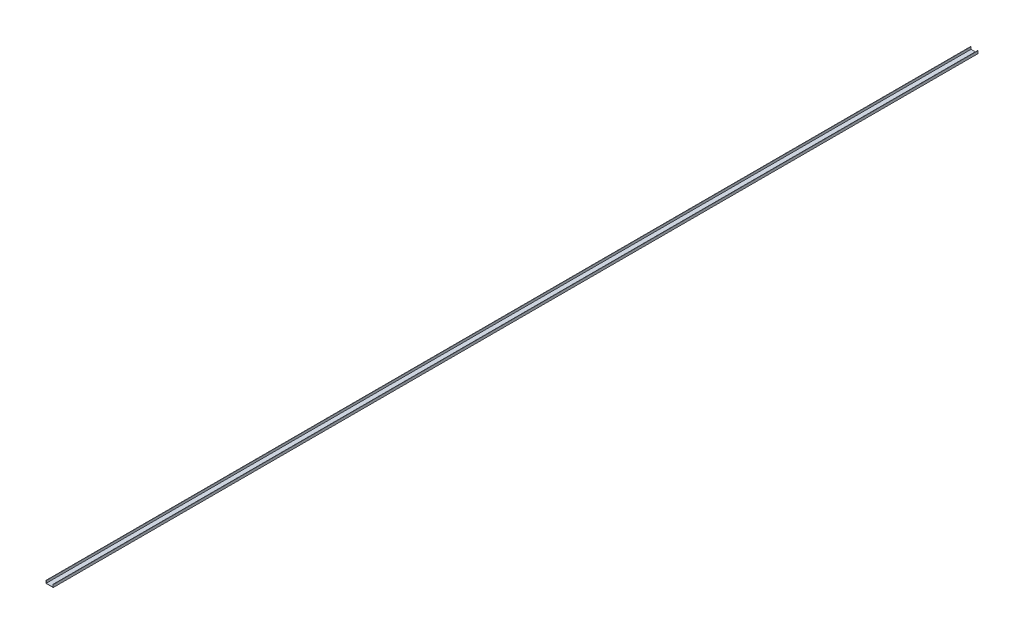
ISO-10303-21;
HEADER;
FILE_DESCRIPTION(('STEP AP214'),'2;1');
FILE_NAME('part.step','',(''),(''),'','','');
FILE_SCHEMA(('AUTOMOTIVE_DESIGN { 1 0 10303 214 1 1 1 1 }'));
ENDSEC;
DATA;
#1=APPLICATION_CONTEXT('core data for automotive mechanical design processes');
#2=APPLICATION_PROTOCOL_DEFINITION('international standard','automotive_design',2000,#1);
#3=PRODUCT_CONTEXT('',#1,'mechanical');
#4=PRODUCT('Part','Part','',(#3));
#5=PRODUCT_RELATED_PRODUCT_CATEGORY('part','',(#4));
#6=PRODUCT_DEFINITION_FORMATION('','',#4);
#7=PRODUCT_DEFINITION_CONTEXT('part definition',#1,'design');
#8=PRODUCT_DEFINITION('design','',#6,#7);
#9=PRODUCT_DEFINITION_SHAPE('','',#8);
#10=(LENGTH_UNIT() NAMED_UNIT(*) SI_UNIT(.MILLI.,.METRE.));
#11=(NAMED_UNIT(*) PLANE_ANGLE_UNIT() SI_UNIT($,.RADIAN.));
#12=(NAMED_UNIT(*) SI_UNIT($,.STERADIAN.) SOLID_ANGLE_UNIT());
#13=UNCERTAINTY_MEASURE_WITH_UNIT(LENGTH_MEASURE(1.E-05),#10,'distance_accuracy_value','');
#14=(GEOMETRIC_REPRESENTATION_CONTEXT(3) GLOBAL_UNCERTAINTY_ASSIGNED_CONTEXT((#13)) GLOBAL_UNIT_ASSIGNED_CONTEXT((#10,
#11,#12)) REPRESENTATION_CONTEXT('',''));
#15=CARTESIAN_POINT('',(0.,0.,0.));
#16=DIRECTION('',(0.,0.,1.));
#17=DIRECTION('',(1.,0.,0.));
#18=AXIS2_PLACEMENT_3D('',#15,#16,#17);
#19=CARTESIAN_POINT('',(0.999999999999999,10.,3460.));
#20=DIRECTION('',(0.,-1.,0.));
#21=DIRECTION('',(0.,0.,-1.));
#22=AXIS2_PLACEMENT_3D('',#19,#20,#21);
#23=PLANE('',#22);
#24=DIRECTION('',(-1.,0.,0.));
#25=VECTOR('',#24,1.);
#26=CARTESIAN_POINT('',(0.999999999999999,10.,0.));
#27=LINE('',#26,#25);
#28=CARTESIAN_POINT('',(0.999999999999999,10.,0.));
#29=VERTEX_POINT('',#28);
#30=CARTESIAN_POINT('',(0.,10.,0.));
#31=VERTEX_POINT('',#30);
#32=EDGE_CURVE('E133',#29,#31,#27,.T.);
#33=ORIENTED_EDGE('',*,*,#32,.T.);
#34=DIRECTION('',(0.,0.,-1.));
#35=VECTOR('',#34,1.);
#36=CARTESIAN_POINT('',(0.,10.,3460.));
#37=LINE('',#36,#35);
#38=CARTESIAN_POINT('',(0.,10.,3460.));
#39=VERTEX_POINT('',#38);
#40=EDGE_CURVE('E11',#39,#31,#37,.T.);
#41=ORIENTED_EDGE('',*,*,#40,.F.);
#42=DIRECTION('',(-1.,0.,0.));
#43=VECTOR('',#42,1.);
#44=CARTESIAN_POINT('',(0.999999999999999,10.,3460.));
#45=LINE('',#44,#43);
#46=CARTESIAN_POINT('',(0.999999999999999,10.,3460.));
#47=VERTEX_POINT('',#46);
#48=EDGE_CURVE('E147',#47,#39,#45,.T.);
#49=ORIENTED_EDGE('',*,*,#48,.F.);
#50=DIRECTION('',(0.,0.,-1.));
#51=VECTOR('',#50,1.);
#52=CARTESIAN_POINT('',(0.999999999999999,10.,3460.));
#53=LINE('',#52,#51);
#54=EDGE_CURVE('E129',#47,#29,#53,.T.);
#55=ORIENTED_EDGE('',*,*,#54,.T.);
#56=EDGE_LOOP('',(#33,#41,#49,#55));
#57=FACE_BOUND('',#56,.T.);
#58=ADVANCED_FACE('F37',(#57),#23,.F.);
#59=CARTESIAN_POINT('',(0.,10.,3460.));
#60=DIRECTION('',(1.,0.,0.));
#61=DIRECTION('',(0.,1.,0.));
#62=AXIS2_PLACEMENT_3D('',#59,#60,#61);
#63=PLANE('',#62);
#64=DIRECTION('',(0.,-1.,0.));
#65=VECTOR('',#64,1.);
#66=CARTESIAN_POINT('',(0.,10.,0.));
#67=LINE('',#66,#65);
#68=CARTESIAN_POINT('',(0.,0.,0.));
#69=VERTEX_POINT('',#68);
#70=EDGE_CURVE('E136',#31,#69,#67,.T.);
#71=ORIENTED_EDGE('',*,*,#70,.T.);
#72=DIRECTION('',(0.,0.,-1.));
#73=VECTOR('',#72,1.);
#74=CARTESIAN_POINT('',(0.,0.,3460.));
#75=LINE('',#74,#73);
#76=CARTESIAN_POINT('',(0.,0.,3460.));
#77=VERTEX_POINT('',#76);
#78=EDGE_CURVE('E45',#77,#69,#75,.T.);
#79=ORIENTED_EDGE('',*,*,#78,.F.);
#80=DIRECTION('',(0.,-1.,0.));
#81=VECTOR('',#80,1.);
#82=CARTESIAN_POINT('',(0.,10.,3460.));
#83=LINE('',#82,#81);
#84=EDGE_CURVE('E96',#39,#77,#83,.T.);
#85=ORIENTED_EDGE('',*,*,#84,.F.);
#86=ORIENTED_EDGE('',*,*,#40,.T.);
#87=EDGE_LOOP('',(#71,#79,#85,#86));
#88=FACE_BOUND('',#87,.T.);
#89=ADVANCED_FACE('F182',(#88),#63,.F.);
#90=CARTESIAN_POINT('',(0.,0.,3460.));
#91=DIRECTION('',(0.,1.,0.));
#92=DIRECTION('',(0.,0.,1.));
#93=AXIS2_PLACEMENT_3D('',#90,#91,#92);
#94=PLANE('',#93);
#95=DIRECTION('',(1.,0.,0.));
#96=VECTOR('',#95,1.);
#97=CARTESIAN_POINT('',(0.,0.,0.));
#98=LINE('',#97,#96);
#99=CARTESIAN_POINT('',(27.,0.,0.));
#100=VERTEX_POINT('',#99);
#101=EDGE_CURVE('E138',#69,#100,#98,.T.);
#102=ORIENTED_EDGE('',*,*,#101,.T.);
#103=DIRECTION('',(0.,0.,-1.));
#104=VECTOR('',#103,1.);
#105=CARTESIAN_POINT('',(27.,0.,3460.));
#106=LINE('',#105,#104);
#107=CARTESIAN_POINT('',(27.,0.,3460.));
#108=VERTEX_POINT('',#107);
#109=EDGE_CURVE('E154',#108,#100,#106,.T.);
#110=ORIENTED_EDGE('',*,*,#109,.F.);
#111=DIRECTION('',(1.,0.,0.));
#112=VECTOR('',#111,1.);
#113=CARTESIAN_POINT('',(0.,0.,3460.));
#114=LINE('',#113,#112);
#115=EDGE_CURVE('E162',#77,#108,#114,.T.);
#116=ORIENTED_EDGE('',*,*,#115,.F.);
#117=ORIENTED_EDGE('',*,*,#78,.T.);
#118=EDGE_LOOP('',(#102,#110,#116,#117));
#119=FACE_BOUND('',#118,.T.);
#120=ADVANCED_FACE('F160',(#119),#94,.F.);
#121=CARTESIAN_POINT('',(27.,0.,3460.));
#122=DIRECTION('',(-1.,0.,0.));
#123=DIRECTION('',(0.,0.,1.));
#124=AXIS2_PLACEMENT_3D('',#121,#122,#123);
#125=PLANE('',#124);
#126=DIRECTION('',(0.,1.,0.));
#127=VECTOR('',#126,1.);
#128=CARTESIAN_POINT('',(27.,0.,0.));
#129=LINE('',#128,#127);
#130=CARTESIAN_POINT('',(27.,10.,0.));
#131=VERTEX_POINT('',#130);
#132=EDGE_CURVE('E140',#100,#131,#129,.T.);
#133=ORIENTED_EDGE('',*,*,#132,.T.);
#134=DIRECTION('',(0.,0.,-1.));
#135=VECTOR('',#134,1.);
#136=CARTESIAN_POINT('',(27.,10.,3460.));
#137=LINE('',#136,#135);
#138=CARTESIAN_POINT('',(27.,10.,3460.));
#139=VERTEX_POINT('',#138);
#140=EDGE_CURVE('E151',#139,#131,#137,.T.);
#141=ORIENTED_EDGE('',*,*,#140,.F.);
#142=DIRECTION('',(0.,1.,0.));
#143=VECTOR('',#142,1.);
#144=CARTESIAN_POINT('',(27.,0.,3460.));
#145=LINE('',#144,#143);
#146=EDGE_CURVE('E174',#108,#139,#145,.T.);
#147=ORIENTED_EDGE('',*,*,#146,.F.);
#148=ORIENTED_EDGE('',*,*,#109,.T.);
#149=EDGE_LOOP('',(#133,#141,#147,#148));
#150=FACE_BOUND('',#149,.T.);
#151=ADVANCED_FACE('F170',(#150),#125,.F.);
#152=CARTESIAN_POINT('',(27.,10.,3460.));
#153=DIRECTION('',(0.,-1.,0.));
#154=DIRECTION('',(1.,0.,0.));
#155=AXIS2_PLACEMENT_3D('',#152,#153,#154);
#156=PLANE('',#155);
#157=DIRECTION('',(-1.,0.,0.));
#158=VECTOR('',#157,1.);
#159=CARTESIAN_POINT('',(27.,10.,0.));
#160=LINE('',#159,#158);
#161=CARTESIAN_POINT('',(26.,10.,0.));
#162=VERTEX_POINT('',#161);
#163=EDGE_CURVE('E142',#131,#162,#160,.T.);
#164=ORIENTED_EDGE('',*,*,#163,.T.);
#165=DIRECTION('',(0.,0.,-1.));
#166=VECTOR('',#165,1.);
#167=CARTESIAN_POINT('',(26.,10.,3460.));
#168=LINE('',#167,#166);
#169=CARTESIAN_POINT('',(26.,10.,3460.));
#170=VERTEX_POINT('',#169);
#171=EDGE_CURVE('E124',#170,#162,#168,.T.);
#172=ORIENTED_EDGE('',*,*,#171,.F.);
#173=DIRECTION('',(-1.,0.,0.));
#174=VECTOR('',#173,1.);
#175=CARTESIAN_POINT('',(27.,10.,3460.));
#176=LINE('',#175,#174);
#177=EDGE_CURVE('E115',#139,#170,#176,.T.);
#178=ORIENTED_EDGE('',*,*,#177,.F.);
#179=ORIENTED_EDGE('',*,*,#140,.T.);
#180=EDGE_LOOP('',(#164,#172,#178,#179));
#181=FACE_BOUND('',#180,.T.);
#182=ADVANCED_FACE('F173',(#181),#156,.F.);
#183=CARTESIAN_POINT('',(26.,10.,3460.));
#184=DIRECTION('',(1.,0.,0.));
#185=DIRECTION('',(0.,0.,-1.));
#186=AXIS2_PLACEMENT_3D('',#183,#184,#185);
#187=PLANE('',#186);
#188=DIRECTION('',(0.,-1.,0.));
#189=VECTOR('',#188,1.);
#190=CARTESIAN_POINT('',(26.,10.,0.));
#191=LINE('',#190,#189);
#192=CARTESIAN_POINT('',(26.,1.,0.));
#193=VERTEX_POINT('',#192);
#194=EDGE_CURVE('E123',#162,#193,#191,.T.);
#195=ORIENTED_EDGE('',*,*,#194,.T.);
#196=DIRECTION('',(0.,0.,-1.));
#197=VECTOR('',#196,1.);
#198=CARTESIAN_POINT('',(26.,1.,3460.));
#199=LINE('',#198,#197);
#200=CARTESIAN_POINT('',(26.,1.,3460.));
#201=VERTEX_POINT('',#200);
#202=EDGE_CURVE('E120',#201,#193,#199,.T.);
#203=ORIENTED_EDGE('',*,*,#202,.F.);
#204=DIRECTION('',(0.,-1.,0.));
#205=VECTOR('',#204,1.);
#206=CARTESIAN_POINT('',(26.,10.,3460.));
#207=LINE('',#206,#205);
#208=EDGE_CURVE('E109',#170,#201,#207,.T.);
#209=ORIENTED_EDGE('',*,*,#208,.F.);
#210=ORIENTED_EDGE('',*,*,#171,.T.);
#211=EDGE_LOOP('',(#195,#203,#209,#210));
#212=FACE_BOUND('',#211,.T.);
#213=ADVANCED_FACE('F121',(#212),#187,.F.);
#214=CARTESIAN_POINT('',(26.,1.,3460.));
#215=DIRECTION('',(0.,-1.,0.));
#216=DIRECTION('',(1.,0.,0.));
#217=AXIS2_PLACEMENT_3D('',#214,#215,#216);
#218=PLANE('',#217);
#219=DIRECTION('',(-1.,0.,0.));
#220=VECTOR('',#219,1.);
#221=CARTESIAN_POINT('',(26.,1.,0.));
#222=LINE('',#221,#220);
#223=CARTESIAN_POINT('',(1.,0.999999999999998,0.));
#224=VERTEX_POINT('',#223);
#225=EDGE_CURVE('E82',#193,#224,#222,.T.);
#226=ORIENTED_EDGE('',*,*,#225,.T.);
#227=DIRECTION('',(0.,0.,-1.));
#228=VECTOR('',#227,1.);
#229=CARTESIAN_POINT('',(1.,0.999999999999998,3460.));
#230=LINE('',#229,#228);
#231=CARTESIAN_POINT('',(1.,0.999999999999998,3460.));
#232=VERTEX_POINT('',#231);
#233=EDGE_CURVE('E125',#232,#224,#230,.T.);
#234=ORIENTED_EDGE('',*,*,#233,.F.);
#235=DIRECTION('',(-1.,0.,0.));
#236=VECTOR('',#235,1.);
#237=CARTESIAN_POINT('',(26.,1.,3460.));
#238=LINE('',#237,#236);
#239=EDGE_CURVE('E113',#201,#232,#238,.T.);
#240=ORIENTED_EDGE('',*,*,#239,.F.);
#241=ORIENTED_EDGE('',*,*,#202,.T.);
#242=EDGE_LOOP('',(#226,#234,#240,#241));
#243=FACE_BOUND('',#242,.T.);
#244=ADVANCED_FACE('F127',(#243),#218,.F.);
#245=CARTESIAN_POINT('',(1.,0.999999999999998,3460.));
#246=DIRECTION('',(-1.,0.,0.));
#247=DIRECTION('',(0.,-1.,0.));
#248=AXIS2_PLACEMENT_3D('',#245,#246,#247);
#249=PLANE('',#248);
#250=DIRECTION('',(0.,1.,0.));
#251=VECTOR('',#250,1.);
#252=CARTESIAN_POINT('',(1.,0.999999999999998,0.));
#253=LINE('',#252,#251);
#254=EDGE_CURVE('E88',#224,#29,#253,.T.);
#255=ORIENTED_EDGE('',*,*,#254,.T.);
#256=ORIENTED_EDGE('',*,*,#54,.F.);
#257=DIRECTION('',(0.,1.,0.));
#258=VECTOR('',#257,1.);
#259=CARTESIAN_POINT('',(1.,0.999999999999998,3460.));
#260=LINE('',#259,#258);
#261=EDGE_CURVE('E53',#232,#47,#260,.T.);
#262=ORIENTED_EDGE('',*,*,#261,.F.);
#263=ORIENTED_EDGE('',*,*,#233,.T.);
#264=EDGE_LOOP('',(#255,#256,#262,#263));
#265=FACE_BOUND('',#264,.T.);
#266=ADVANCED_FACE('F198',(#265),#249,.F.);
#267=CARTESIAN_POINT('',(0.,0.,3460.));
#268=DIRECTION('',(0.,0.,1.));
#269=DIRECTION('',(1.,0.,0.));
#270=AXIS2_PLACEMENT_3D('',#267,#268,#269);
#271=PLANE('',#270);
#272=ORIENTED_EDGE('',*,*,#48,.T.);
#273=ORIENTED_EDGE('',*,*,#84,.T.);
#274=ORIENTED_EDGE('',*,*,#115,.T.);
#275=ORIENTED_EDGE('',*,*,#146,.T.);
#276=ORIENTED_EDGE('',*,*,#177,.T.);
#277=ORIENTED_EDGE('',*,*,#208,.T.);
#278=ORIENTED_EDGE('',*,*,#239,.T.);
#279=ORIENTED_EDGE('',*,*,#261,.T.);
#280=EDGE_LOOP('',(#272,#273,#274,#275,#276,#277,#278,#279));
#281=FACE_BOUND('',#280,.T.);
#282=ADVANCED_FACE('F111',(#281),#271,.T.);
#283=CARTESIAN_POINT('',(0.,0.,0.));
#284=DIRECTION('',(0.,0.,1.));
#285=DIRECTION('',(1.,0.,0.));
#286=AXIS2_PLACEMENT_3D('',#283,#284,#285);
#287=PLANE('',#286);
#288=ORIENTED_EDGE('',*,*,#32,.F.);
#289=ORIENTED_EDGE('',*,*,#254,.F.);
#290=ORIENTED_EDGE('',*,*,#225,.F.);
#291=ORIENTED_EDGE('',*,*,#194,.F.);
#292=ORIENTED_EDGE('',*,*,#163,.F.);
#293=ORIENTED_EDGE('',*,*,#132,.F.);
#294=ORIENTED_EDGE('',*,*,#101,.F.);
#295=ORIENTED_EDGE('',*,*,#70,.F.);
#296=EDGE_LOOP('',(#288,#289,#290,#291,#292,#293,#294,#295));
#297=FACE_BOUND('',#296,.T.);
#298=ADVANCED_FACE('F166',(#297),#287,.F.);
#299=CLOSED_SHELL('',(#58,#89,#120,#151,#182,#213,#244,#266,#282,#298));
#300=MANIFOLD_SOLID_BREP('B2',#299);
#301=ADVANCED_BREP_SHAPE_REPRESENTATION('',(#18,#300),#14);
#302=SHAPE_DEFINITION_REPRESENTATION(#9,#301);
ENDSEC;
END-ISO-10303-21;
